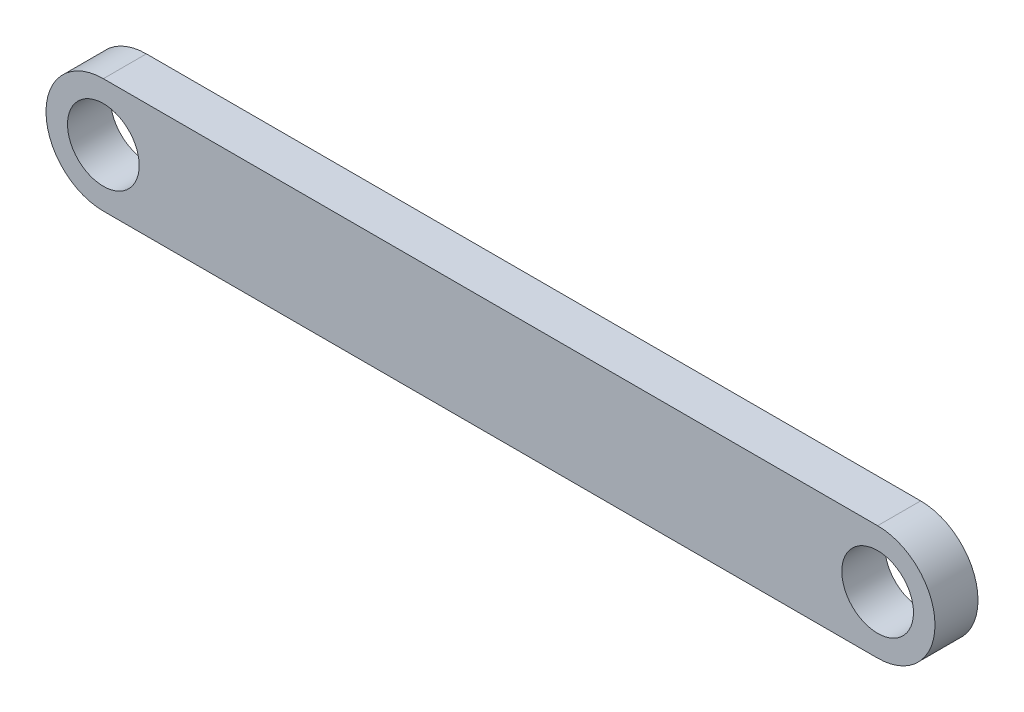
ISO-10303-21;
HEADER;
FILE_DESCRIPTION(('STEP AP214'),'2;1');
FILE_NAME('part.step','',(''),(''),'','','');
FILE_SCHEMA(('AUTOMOTIVE_DESIGN { 1 0 10303 214 1 1 1 1 }'));
ENDSEC;
DATA;
#1=APPLICATION_CONTEXT('core data for automotive mechanical design processes');
#2=APPLICATION_PROTOCOL_DEFINITION('international standard','automotive_design',2000,#1);
#3=PRODUCT_CONTEXT('',#1,'mechanical');
#4=PRODUCT('Part','Part','',(#3));
#5=PRODUCT_RELATED_PRODUCT_CATEGORY('part','',(#4));
#6=PRODUCT_DEFINITION_FORMATION('','',#4);
#7=PRODUCT_DEFINITION_CONTEXT('part definition',#1,'design');
#8=PRODUCT_DEFINITION('design','',#6,#7);
#9=PRODUCT_DEFINITION_SHAPE('','',#8);
#10=(LENGTH_UNIT() NAMED_UNIT(*) SI_UNIT(.MILLI.,.METRE.));
#11=(NAMED_UNIT(*) PLANE_ANGLE_UNIT() SI_UNIT($,.RADIAN.));
#12=(NAMED_UNIT(*) SI_UNIT($,.STERADIAN.) SOLID_ANGLE_UNIT());
#13=UNCERTAINTY_MEASURE_WITH_UNIT(LENGTH_MEASURE(1.E-05),#10,'distance_accuracy_value','');
#14=(GEOMETRIC_REPRESENTATION_CONTEXT(3) GLOBAL_UNCERTAINTY_ASSIGNED_CONTEXT((#13)) GLOBAL_UNIT_ASSIGNED_CONTEXT((#10,
#11,#12)) REPRESENTATION_CONTEXT('',''));
#15=CARTESIAN_POINT('',(0.,0.,0.));
#16=DIRECTION('',(0.,0.,1.));
#17=DIRECTION('',(1.,0.,0.));
#18=AXIS2_PLACEMENT_3D('',#15,#16,#17);
#19=CARTESIAN_POINT('',(0.,0.,3.));
#20=DIRECTION('',(0.,0.,1.));
#21=DIRECTION('',(1.,0.,0.));
#22=AXIS2_PLACEMENT_3D('',#19,#20,#21);
#23=PLANE('',#22);
#24=CARTESIAN_POINT('',(-54.,0.,3.));
#25=DIRECTION('',(0.,0.,1.));
#26=DIRECTION('',(1.,0.,0.));
#27=AXIS2_PLACEMENT_3D('',#24,#25,#26);
#28=CIRCLE('',#27,2.5);
#29=CARTESIAN_POINT('',(-51.5,0.,3.));
#30=VERTEX_POINT('',#29);
#31=EDGE_CURVE('E112',#30,#30,#28,.T.);
#32=ORIENTED_EDGE('',*,*,#31,.F.);
#33=EDGE_LOOP('',(#32));
#34=FACE_BOUND('',#33,.T.);
#35=CARTESIAN_POINT('',(0.,0.,3.));
#36=DIRECTION('',(0.,0.,1.));
#37=DIRECTION('',(1.,0.,0.));
#38=AXIS2_PLACEMENT_3D('',#35,#36,#37);
#39=CIRCLE('',#38,4.);
#40=CARTESIAN_POINT('',(0.,-4.,3.));
#41=VERTEX_POINT('',#40);
#42=CARTESIAN_POINT('',(0.,4.,3.));
#43=VERTEX_POINT('',#42);
#44=EDGE_CURVE('E92',#41,#43,#39,.T.);
#45=ORIENTED_EDGE('',*,*,#44,.T.);
#46=DIRECTION('',(-1.,0.,0.));
#47=VECTOR('',#46,1.);
#48=CARTESIAN_POINT('',(-54.,3.99999999999999,3.));
#49=LINE('',#48,#47);
#50=CARTESIAN_POINT('',(-54.,3.99999999999999,3.));
#51=VERTEX_POINT('',#50);
#52=EDGE_CURVE('E87',#43,#51,#49,.T.);
#53=ORIENTED_EDGE('',*,*,#52,.T.);
#54=CARTESIAN_POINT('',(-54.,0.,3.));
#55=DIRECTION('',(0.,0.,1.));
#56=DIRECTION('',(1.,0.,0.));
#57=AXIS2_PLACEMENT_3D('',#54,#55,#56);
#58=CIRCLE('',#57,4.);
#59=CARTESIAN_POINT('',(-54.,-4.00000000000001,3.));
#60=VERTEX_POINT('',#59);
#61=EDGE_CURVE('E90',#51,#60,#58,.T.);
#62=ORIENTED_EDGE('',*,*,#61,.T.);
#63=DIRECTION('',(1.,0.,0.));
#64=VECTOR('',#63,1.);
#65=CARTESIAN_POINT('',(-54.,-4.00000000000001,3.));
#66=LINE('',#65,#64);
#67=EDGE_CURVE('E57',#60,#41,#66,.T.);
#68=ORIENTED_EDGE('',*,*,#67,.T.);
#69=EDGE_LOOP('',(#45,#53,#62,#68));
#70=FACE_BOUND('',#69,.T.);
#71=CARTESIAN_POINT('',(0.,0.,3.));
#72=DIRECTION('',(0.,0.,1.));
#73=DIRECTION('',(1.,0.,0.));
#74=AXIS2_PLACEMENT_3D('',#71,#72,#73);
#75=CIRCLE('',#74,2.5);
#76=CARTESIAN_POINT('',(2.5,0.,3.));
#77=VERTEX_POINT('',#76);
#78=EDGE_CURVE('E134',#77,#77,#75,.T.);
#79=ORIENTED_EDGE('',*,*,#78,.F.);
#80=EDGE_LOOP('',(#79));
#81=FACE_BOUND('',#80,.T.);
#82=ADVANCED_FACE('F39',(#34,#70,#81),#23,.T.);
#83=CARTESIAN_POINT('',(0.,0.,0.));
#84=DIRECTION('',(0.,0.,1.));
#85=DIRECTION('',(1.,0.,0.));
#86=AXIS2_PLACEMENT_3D('',#83,#84,#85);
#87=PLANE('',#86);
#88=CARTESIAN_POINT('',(0.,0.,0.));
#89=DIRECTION('',(0.,0.,1.));
#90=DIRECTION('',(1.,0.,0.));
#91=AXIS2_PLACEMENT_3D('',#88,#89,#90);
#92=CIRCLE('',#91,4.);
#93=CARTESIAN_POINT('',(0.,-4.,0.));
#94=VERTEX_POINT('',#93);
#95=CARTESIAN_POINT('',(0.,4.,0.));
#96=VERTEX_POINT('',#95);
#97=EDGE_CURVE('E108',#94,#96,#92,.T.);
#98=ORIENTED_EDGE('',*,*,#97,.F.);
#99=DIRECTION('',(1.,0.,0.));
#100=VECTOR('',#99,1.);
#101=CARTESIAN_POINT('',(-54.,-4.00000000000001,0.));
#102=LINE('',#101,#100);
#103=CARTESIAN_POINT('',(-54.,-4.00000000000001,0.));
#104=VERTEX_POINT('',#103);
#105=EDGE_CURVE('E80',#104,#94,#102,.T.);
#106=ORIENTED_EDGE('',*,*,#105,.F.);
#107=CARTESIAN_POINT('',(-54.,0.,0.));
#108=DIRECTION('',(0.,0.,1.));
#109=DIRECTION('',(1.,0.,0.));
#110=AXIS2_PLACEMENT_3D('',#107,#108,#109);
#111=CIRCLE('',#110,4.);
#112=CARTESIAN_POINT('',(-54.,3.99999999999999,0.));
#113=VERTEX_POINT('',#112);
#114=EDGE_CURVE('E74',#113,#104,#111,.T.);
#115=ORIENTED_EDGE('',*,*,#114,.F.);
#116=DIRECTION('',(-1.,0.,0.));
#117=VECTOR('',#116,1.);
#118=CARTESIAN_POINT('',(-54.,3.99999999999999,0.));
#119=LINE('',#118,#117);
#120=EDGE_CURVE('E97',#96,#113,#119,.T.);
#121=ORIENTED_EDGE('',*,*,#120,.F.);
#122=EDGE_LOOP('',(#98,#106,#115,#121));
#123=FACE_BOUND('',#122,.T.);
#124=CARTESIAN_POINT('',(-54.,0.,0.));
#125=DIRECTION('',(0.,0.,1.));
#126=DIRECTION('',(1.,0.,0.));
#127=AXIS2_PLACEMENT_3D('',#124,#125,#126);
#128=CIRCLE('',#127,2.5);
#129=CARTESIAN_POINT('',(-51.5,0.,0.));
#130=VERTEX_POINT('',#129);
#131=EDGE_CURVE('E130',#130,#130,#128,.T.);
#132=ORIENTED_EDGE('',*,*,#131,.T.);
#133=EDGE_LOOP('',(#132));
#134=FACE_BOUND('',#133,.T.);
#135=CARTESIAN_POINT('',(0.,0.,0.));
#136=DIRECTION('',(0.,0.,1.));
#137=DIRECTION('',(1.,0.,0.));
#138=AXIS2_PLACEMENT_3D('',#135,#136,#137);
#139=CIRCLE('',#138,2.5);
#140=CARTESIAN_POINT('',(2.5,0.,0.));
#141=VERTEX_POINT('',#140);
#142=EDGE_CURVE('E138',#141,#141,#139,.T.);
#143=ORIENTED_EDGE('',*,*,#142,.T.);
#144=EDGE_LOOP('',(#143));
#145=FACE_BOUND('',#144,.T.);
#146=ADVANCED_FACE('F125',(#123,#134,#145),#87,.F.);
#147=CARTESIAN_POINT('',(0.,0.,3.));
#148=DIRECTION('',(0.,0.,-1.));
#149=DIRECTION('',(-1.,0.,0.));
#150=AXIS2_PLACEMENT_3D('',#147,#148,#149);
#151=CYLINDRICAL_SURFACE('',#150,4.);
#152=ORIENTED_EDGE('',*,*,#97,.T.);
#153=DIRECTION('',(0.,0.,-1.));
#154=VECTOR('',#153,1.);
#155=CARTESIAN_POINT('',(0.,4.,3.));
#156=LINE('',#155,#154);
#157=EDGE_CURVE('E11',#43,#96,#156,.T.);
#158=ORIENTED_EDGE('',*,*,#157,.F.);
#159=ORIENTED_EDGE('',*,*,#44,.F.);
#160=DIRECTION('',(0.,0.,-1.));
#161=VECTOR('',#160,1.);
#162=CARTESIAN_POINT('',(0.,-4.,3.));
#163=LINE('',#162,#161);
#164=EDGE_CURVE('E104',#41,#94,#163,.T.);
#165=ORIENTED_EDGE('',*,*,#164,.T.);
#166=EDGE_LOOP('',(#152,#158,#159,#165));
#167=FACE_BOUND('',#166,.T.);
#168=ADVANCED_FACE('F41',(#167),#151,.T.);
#169=CARTESIAN_POINT('',(-54.,3.99999999999999,3.));
#170=DIRECTION('',(0.,-1.,0.));
#171=DIRECTION('',(1.,0.,0.));
#172=AXIS2_PLACEMENT_3D('',#169,#170,#171);
#173=PLANE('',#172);
#174=ORIENTED_EDGE('',*,*,#120,.T.);
#175=DIRECTION('',(0.,0.,-1.));
#176=VECTOR('',#175,1.);
#177=CARTESIAN_POINT('',(-54.,3.99999999999999,3.));
#178=LINE('',#177,#176);
#179=EDGE_CURVE('E49',#51,#113,#178,.T.);
#180=ORIENTED_EDGE('',*,*,#179,.F.);
#181=ORIENTED_EDGE('',*,*,#52,.F.);
#182=ORIENTED_EDGE('',*,*,#157,.T.);
#183=EDGE_LOOP('',(#174,#180,#181,#182));
#184=FACE_BOUND('',#183,.T.);
#185=ADVANCED_FACE('F96',(#184),#173,.F.);
#186=CARTESIAN_POINT('',(-54.,0.,3.));
#187=DIRECTION('',(0.,0.,-1.));
#188=DIRECTION('',(-1.,0.,0.));
#189=AXIS2_PLACEMENT_3D('',#186,#187,#188);
#190=CYLINDRICAL_SURFACE('',#189,4.);
#191=ORIENTED_EDGE('',*,*,#114,.T.);
#192=DIRECTION('',(0.,0.,-1.));
#193=VECTOR('',#192,1.);
#194=CARTESIAN_POINT('',(-54.,-4.00000000000001,3.));
#195=LINE('',#194,#193);
#196=EDGE_CURVE('E99',#60,#104,#195,.T.);
#197=ORIENTED_EDGE('',*,*,#196,.F.);
#198=ORIENTED_EDGE('',*,*,#61,.F.);
#199=ORIENTED_EDGE('',*,*,#179,.T.);
#200=EDGE_LOOP('',(#191,#197,#198,#199));
#201=FACE_BOUND('',#200,.T.);
#202=ADVANCED_FACE('F100',(#201),#190,.T.);
#203=CARTESIAN_POINT('',(-54.,-4.00000000000001,3.));
#204=DIRECTION('',(0.,1.,0.));
#205=DIRECTION('',(-1.,0.,0.));
#206=AXIS2_PLACEMENT_3D('',#203,#204,#205);
#207=PLANE('',#206);
#208=ORIENTED_EDGE('',*,*,#105,.T.);
#209=ORIENTED_EDGE('',*,*,#164,.F.);
#210=ORIENTED_EDGE('',*,*,#67,.F.);
#211=ORIENTED_EDGE('',*,*,#196,.T.);
#212=EDGE_LOOP('',(#208,#209,#210,#211));
#213=FACE_BOUND('',#212,.T.);
#214=ADVANCED_FACE('F122',(#213),#207,.F.);
#215=CARTESIAN_POINT('',(-54.,0.,3.));
#216=DIRECTION('',(0.,0.,-1.));
#217=DIRECTION('',(-1.,0.,0.));
#218=AXIS2_PLACEMENT_3D('',#215,#216,#217);
#219=CYLINDRICAL_SURFACE('',#218,2.5);
#220=ORIENTED_EDGE('',*,*,#31,.T.);
#221=EDGE_LOOP('',(#220));
#222=FACE_BOUND('',#221,.T.);
#223=ORIENTED_EDGE('',*,*,#131,.F.);
#224=EDGE_LOOP('',(#223));
#225=FACE_BOUND('',#224,.T.);
#226=ADVANCED_FACE('F157',(#222,#225),#219,.F.);
#227=CARTESIAN_POINT('',(0.,0.,3.));
#228=DIRECTION('',(0.,0.,-1.));
#229=DIRECTION('',(-1.,0.,0.));
#230=AXIS2_PLACEMENT_3D('',#227,#228,#229);
#231=CYLINDRICAL_SURFACE('',#230,2.5);
#232=ORIENTED_EDGE('',*,*,#78,.T.);
#233=EDGE_LOOP('',(#232));
#234=FACE_BOUND('',#233,.T.);
#235=ORIENTED_EDGE('',*,*,#142,.F.);
#236=EDGE_LOOP('',(#235));
#237=FACE_BOUND('',#236,.T.);
#238=ADVANCED_FACE('F146',(#234,#237),#231,.F.);
#239=CLOSED_SHELL('',(#82,#146,#168,#185,#202,#214,#226,#238));
#240=MANIFOLD_SOLID_BREP('B2',#239);
#241=ADVANCED_BREP_SHAPE_REPRESENTATION('',(#18,#240),#14);
#242=SHAPE_DEFINITION_REPRESENTATION(#9,#241);
ENDSEC;
END-ISO-10303-21;
